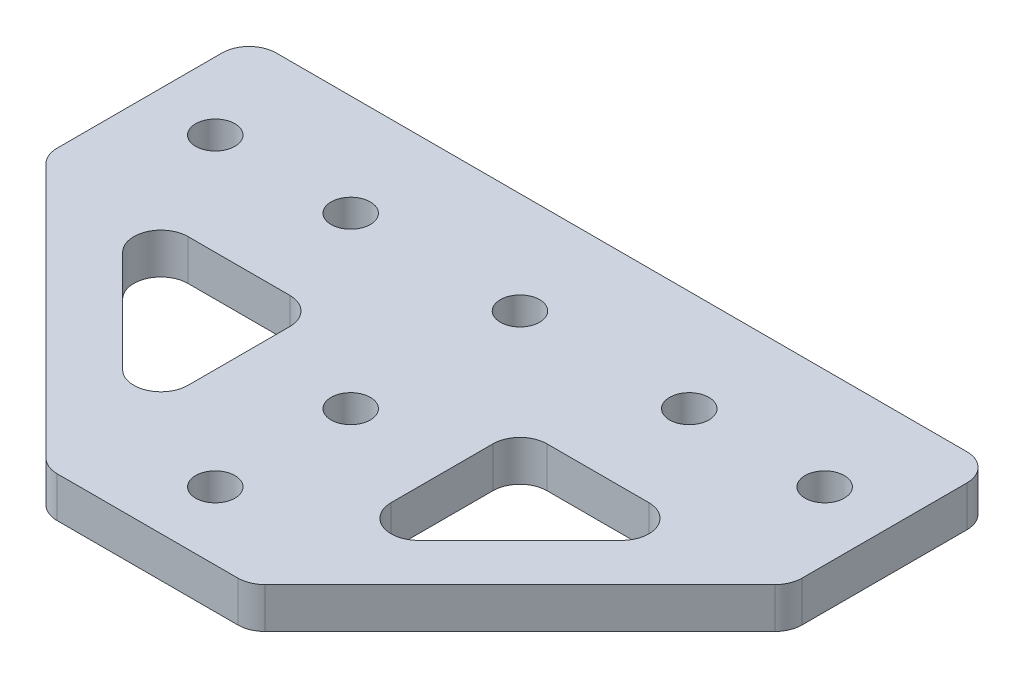
ISO-10303-21;
HEADER;
FILE_DESCRIPTION(('STEP AP214'),'2;1');
FILE_NAME('part.step','',(''),(''),'','','');
FILE_SCHEMA(('AUTOMOTIVE_DESIGN { 1 0 10303 214 1 1 1 1 }'));
ENDSEC;
DATA;
#1=APPLICATION_CONTEXT('core data for automotive mechanical design processes');
#2=APPLICATION_PROTOCOL_DEFINITION('international standard','automotive_design',2000,#1);
#3=PRODUCT_CONTEXT('',#1,'mechanical');
#4=PRODUCT('Part','Part','',(#3));
#5=PRODUCT_RELATED_PRODUCT_CATEGORY('part','',(#4));
#6=PRODUCT_DEFINITION_FORMATION('','',#4);
#7=PRODUCT_DEFINITION_CONTEXT('part definition',#1,'design');
#8=PRODUCT_DEFINITION('design','',#6,#7);
#9=PRODUCT_DEFINITION_SHAPE('','',#8);
#10=(LENGTH_UNIT() NAMED_UNIT(*) SI_UNIT(.MILLI.,.METRE.));
#11=(NAMED_UNIT(*) PLANE_ANGLE_UNIT() SI_UNIT($,.RADIAN.));
#12=(NAMED_UNIT(*) SI_UNIT($,.STERADIAN.) SOLID_ANGLE_UNIT());
#13=UNCERTAINTY_MEASURE_WITH_UNIT(LENGTH_MEASURE(1.E-05),#10,'distance_accuracy_value','');
#14=(GEOMETRIC_REPRESENTATION_CONTEXT(3) GLOBAL_UNCERTAINTY_ASSIGNED_CONTEXT((#13)) GLOBAL_UNIT_ASSIGNED_CONTEXT((#10,
#11,#12)) REPRESENTATION_CONTEXT('',''));
#15=CARTESIAN_POINT('',(0.,0.,0.));
#16=DIRECTION('',(0.,0.,1.));
#17=DIRECTION('',(1.,0.,0.));
#18=AXIS2_PLACEMENT_3D('',#15,#16,#17);
#19=CARTESIAN_POINT('',(0.,3.,0.));
#20=DIRECTION('',(1.,0.,0.));
#21=DIRECTION('',(0.,0.,-1.));
#22=AXIS2_PLACEMENT_3D('',#19,#20,#21);
#23=PLANE('',#22);
#24=DIRECTION('',(0.,0.,1.));
#25=VECTOR('',#24,1.);
#26=CARTESIAN_POINT('',(0.,0.,0.));
#27=LINE('',#26,#25);
#28=CARTESIAN_POINT('',(0.,0.,17.));
#29=VERTEX_POINT('',#28);
#30=CARTESIAN_POINT('',(0.,0.,24.5147186257614));
#31=VERTEX_POINT('',#30);
#32=EDGE_CURVE('E396',#29,#31,#27,.T.);
#33=ORIENTED_EDGE('',*,*,#32,.F.);
#34=DIRECTION('',(0.,-1.,0.));
#35=VECTOR('',#34,1.);
#36=CARTESIAN_POINT('',(0.,3.,17.));
#37=LINE('',#36,#35);
#38=CARTESIAN_POINT('',(0.,3.,17.));
#39=VERTEX_POINT('',#38);
#40=EDGE_CURVE('E233',#29,#39,#37,.F.);
#41=ORIENTED_EDGE('',*,*,#40,.T.);
#42=DIRECTION('',(0.,0.,1.));
#43=VECTOR('',#42,1.);
#44=CARTESIAN_POINT('',(0.,3.,0.));
#45=LINE('',#44,#43);
#46=CARTESIAN_POINT('',(0.,3.,24.5147186257614));
#47=VERTEX_POINT('',#46);
#48=EDGE_CURVE('E212',#39,#47,#45,.T.);
#49=ORIENTED_EDGE('',*,*,#48,.T.);
#50=DIRECTION('',(0.,1.,0.));
#51=VECTOR('',#50,1.);
#52=CARTESIAN_POINT('',(0.,3.,24.5147186257614));
#53=LINE('',#52,#51);
#54=EDGE_CURVE('E231',#47,#31,#53,.F.);
#55=ORIENTED_EDGE('',*,*,#54,.T.);
#56=EDGE_LOOP('',(#33,#41,#49,#55));
#57=FACE_BOUND('',#56,.T.);
#58=ADVANCED_FACE('F43',(#57),#23,.T.);
#59=CARTESIAN_POINT('',(0.,3.,15.));
#60=DIRECTION('',(0.,0.,-1.));
#61=DIRECTION('',(-1.,0.,0.));
#62=AXIS2_PLACEMENT_3D('',#59,#60,#61);
#63=PLANE('',#62);
#64=DIRECTION('',(1.,0.,0.));
#65=VECTOR('',#64,1.);
#66=CARTESIAN_POINT('',(0.,3.,15.));
#67=LINE('',#66,#65);
#68=CARTESIAN_POINT('',(2.,3.,15.));
#69=VERTEX_POINT('',#68);
#70=CARTESIAN_POINT('',(9.51471862576143,3.,15.));
#71=VERTEX_POINT('',#70);
#72=EDGE_CURVE('E210',#69,#71,#67,.T.);
#73=ORIENTED_EDGE('',*,*,#72,.F.);
#74=DIRECTION('',(0.,-1.,0.));
#75=VECTOR('',#74,1.);
#76=CARTESIAN_POINT('',(2.,3.,15.));
#77=LINE('',#76,#75);
#78=CARTESIAN_POINT('',(2.,0.,15.));
#79=VERTEX_POINT('',#78);
#80=EDGE_CURVE('E224',#69,#79,#77,.T.);
#81=ORIENTED_EDGE('',*,*,#80,.T.);
#82=DIRECTION('',(1.,0.,0.));
#83=VECTOR('',#82,1.);
#84=CARTESIAN_POINT('',(0.,0.,15.));
#85=LINE('',#84,#83);
#86=CARTESIAN_POINT('',(9.51471862576143,0.,15.));
#87=VERTEX_POINT('',#86);
#88=EDGE_CURVE('E399',#79,#87,#85,.T.);
#89=ORIENTED_EDGE('',*,*,#88,.T.);
#90=DIRECTION('',(0.,1.,0.));
#91=VECTOR('',#90,1.);
#92=CARTESIAN_POINT('',(9.51471862576143,3.,15.));
#93=LINE('',#92,#91);
#94=EDGE_CURVE('E227',#87,#71,#93,.T.);
#95=ORIENTED_EDGE('',*,*,#94,.T.);
#96=EDGE_LOOP('',(#73,#81,#89,#95));
#97=FACE_BOUND('',#96,.T.);
#98=ADVANCED_FACE('F222',(#97),#63,.F.);
#99=CARTESIAN_POINT('',(-15.,3.,0.));
#100=DIRECTION('',(-1.,0.,0.));
#101=DIRECTION('',(0.,0.,1.));
#102=AXIS2_PLACEMENT_3D('',#99,#100,#101);
#103=PLANE('',#102);
#104=DIRECTION('',(0.,0.,-1.));
#105=VECTOR('',#104,1.);
#106=CARTESIAN_POINT('',(-15.,0.,0.));
#107=LINE('',#106,#105);
#108=CARTESIAN_POINT('',(-15.,0.,24.5147186257614));
#109=VERTEX_POINT('',#108);
#110=CARTESIAN_POINT('',(-15.,0.,17.));
#111=VERTEX_POINT('',#110);
#112=EDGE_CURVE('E336',#109,#111,#107,.T.);
#113=ORIENTED_EDGE('',*,*,#112,.F.);
#114=DIRECTION('',(0.,1.,0.));
#115=VECTOR('',#114,1.);
#116=CARTESIAN_POINT('',(-15.,3.,24.5147186257614));
#117=LINE('',#116,#115);
#118=CARTESIAN_POINT('',(-15.,3.,24.5147186257614));
#119=VERTEX_POINT('',#118);
#120=EDGE_CURVE('E302',#109,#119,#117,.T.);
#121=ORIENTED_EDGE('',*,*,#120,.T.);
#122=DIRECTION('',(0.,0.,-1.));
#123=VECTOR('',#122,1.);
#124=CARTESIAN_POINT('',(-15.,3.,0.));
#125=LINE('',#124,#123);
#126=CARTESIAN_POINT('',(-15.,3.,17.));
#127=VERTEX_POINT('',#126);
#128=EDGE_CURVE('E349',#119,#127,#125,.T.);
#129=ORIENTED_EDGE('',*,*,#128,.T.);
#130=DIRECTION('',(0.,-1.,0.));
#131=VECTOR('',#130,1.);
#132=CARTESIAN_POINT('',(-15.,3.,17.));
#133=LINE('',#132,#131);
#134=EDGE_CURVE('E299',#127,#111,#133,.T.);
#135=ORIENTED_EDGE('',*,*,#134,.T.);
#136=EDGE_LOOP('',(#113,#121,#129,#135));
#137=FACE_BOUND('',#136,.T.);
#138=ADVANCED_FACE('F348',(#137),#103,.T.);
#139=CARTESIAN_POINT('',(0.,3.,35.));
#140=DIRECTION('',(0.,0.,1.));
#141=DIRECTION('',(1.,0.,0.));
#142=AXIS2_PLACEMENT_3D('',#139,#140,#141);
#143=PLANE('',#142);
#144=DIRECTION('',(-1.,0.,0.));
#145=VECTOR('',#144,1.);
#146=CARTESIAN_POINT('',(0.,0.,35.));
#147=LINE('',#146,#145);
#148=CARTESIAN_POINT('',(-0.828427124746186,0.,35.));
#149=VERTEX_POINT('',#148);
#150=CARTESIAN_POINT('',(-14.1715728752538,0.,35.));
#151=VERTEX_POINT('',#150);
#152=EDGE_CURVE('E393',#149,#151,#147,.T.);
#153=ORIENTED_EDGE('',*,*,#152,.F.);
#154=DIRECTION('',(0.,-1.,0.));
#155=VECTOR('',#154,1.);
#156=CARTESIAN_POINT('',(-0.828427124746186,3.,35.));
#157=LINE('',#156,#155);
#158=CARTESIAN_POINT('',(-0.828427124746186,3.,35.));
#159=VERTEX_POINT('',#158);
#160=EDGE_CURVE('E287',#149,#159,#157,.F.);
#161=ORIENTED_EDGE('',*,*,#160,.T.);
#162=DIRECTION('',(-1.,0.,0.));
#163=VECTOR('',#162,1.);
#164=CARTESIAN_POINT('',(0.,3.,35.));
#165=LINE('',#164,#163);
#166=CARTESIAN_POINT('',(-14.1715728752538,3.,35.));
#167=VERTEX_POINT('',#166);
#168=EDGE_CURVE('E350',#159,#167,#165,.T.);
#169=ORIENTED_EDGE('',*,*,#168,.T.);
#170=DIRECTION('',(0.,-1.,0.));
#171=VECTOR('',#170,1.);
#172=CARTESIAN_POINT('',(-14.1715728752538,3.,35.));
#173=LINE('',#172,#171);
#174=EDGE_CURVE('E284',#167,#151,#173,.T.);
#175=ORIENTED_EDGE('',*,*,#174,.T.);
#176=EDGE_LOOP('',(#153,#161,#169,#175));
#177=FACE_BOUND('',#176,.T.);
#178=ADVANCED_FACE('F483',(#177),#143,.T.);
#179=CARTESIAN_POINT('',(20.,3.,0.));
#180=DIRECTION('',(-1.,0.,0.));
#181=DIRECTION('',(0.,0.,1.));
#182=AXIS2_PLACEMENT_3D('',#179,#180,#181);
#183=PLANE('',#182);
#184=DIRECTION('',(0.,0.,-1.));
#185=VECTOR('',#184,1.);
#186=CARTESIAN_POINT('',(20.,0.,0.));
#187=LINE('',#186,#185);
#188=CARTESIAN_POINT('',(20.,0.,14.1715728752538));
#189=VERTEX_POINT('',#188);
#190=CARTESIAN_POINT('',(20.,0.,2.));
#191=VERTEX_POINT('',#190);
#192=EDGE_CURVE('E401',#189,#191,#187,.T.);
#193=ORIENTED_EDGE('',*,*,#192,.T.);
#194=DIRECTION('',(0.,-1.,0.));
#195=VECTOR('',#194,1.);
#196=CARTESIAN_POINT('',(20.,3.,2.));
#197=LINE('',#196,#195);
#198=CARTESIAN_POINT('',(20.,3.,2.));
#199=VERTEX_POINT('',#198);
#200=EDGE_CURVE('E265',#191,#199,#197,.F.);
#201=ORIENTED_EDGE('',*,*,#200,.T.);
#202=DIRECTION('',(0.,0.,-1.));
#203=VECTOR('',#202,1.);
#204=CARTESIAN_POINT('',(20.,3.,0.));
#205=LINE('',#204,#203);
#206=CARTESIAN_POINT('',(20.,3.,14.1715728752538));
#207=VERTEX_POINT('',#206);
#208=EDGE_CURVE('E228',#207,#199,#205,.T.);
#209=ORIENTED_EDGE('',*,*,#208,.F.);
#210=DIRECTION('',(0.,-1.,0.));
#211=VECTOR('',#210,1.);
#212=CARTESIAN_POINT('',(20.,3.,14.1715728752538));
#213=LINE('',#212,#211);
#214=EDGE_CURVE('E262',#207,#189,#213,.T.);
#215=ORIENTED_EDGE('',*,*,#214,.T.);
#216=EDGE_LOOP('',(#193,#201,#209,#215));
#217=FACE_BOUND('',#216,.T.);
#218=ADVANCED_FACE('F486',(#217),#183,.F.);
#219=CARTESIAN_POINT('',(0.,3.,0.));
#220=DIRECTION('',(0.,0.,1.));
#221=DIRECTION('',(1.,0.,0.));
#222=AXIS2_PLACEMENT_3D('',#219,#220,#221);
#223=PLANE('',#222);
#224=DIRECTION('',(-1.,0.,0.));
#225=VECTOR('',#224,1.);
#226=CARTESIAN_POINT('',(0.,3.,0.));
#227=LINE('',#226,#225);
#228=CARTESIAN_POINT('',(18.,3.,0.));
#229=VERTEX_POINT('',#228);
#230=CARTESIAN_POINT('',(-33.,3.,0.));
#231=VERTEX_POINT('',#230);
#232=EDGE_CURVE('E363',#229,#231,#227,.T.);
#233=ORIENTED_EDGE('',*,*,#232,.F.);
#234=DIRECTION('',(0.,-1.,0.));
#235=VECTOR('',#234,1.);
#236=CARTESIAN_POINT('',(18.,3.,0.));
#237=LINE('',#236,#235);
#238=CARTESIAN_POINT('',(18.,0.,0.));
#239=VERTEX_POINT('',#238);
#240=EDGE_CURVE('E247',#229,#239,#237,.T.);
#241=ORIENTED_EDGE('',*,*,#240,.T.);
#242=DIRECTION('',(-1.,0.,0.));
#243=VECTOR('',#242,1.);
#244=CARTESIAN_POINT('',(0.,0.,0.));
#245=LINE('',#244,#243);
#246=CARTESIAN_POINT('',(-33.,0.,0.));
#247=VERTEX_POINT('',#246);
#248=EDGE_CURVE('E404',#239,#247,#245,.T.);
#249=ORIENTED_EDGE('',*,*,#248,.T.);
#250=DIRECTION('',(0.,-1.,0.));
#251=VECTOR('',#250,1.);
#252=CARTESIAN_POINT('',(-33.,3.,0.));
#253=LINE('',#252,#251);
#254=EDGE_CURVE('E245',#247,#231,#253,.F.);
#255=ORIENTED_EDGE('',*,*,#254,.T.);
#256=EDGE_LOOP('',(#233,#241,#249,#255));
#257=FACE_BOUND('',#256,.T.);
#258=ADVANCED_FACE('F468',(#257),#223,.F.);
#259=CARTESIAN_POINT('',(-35.,3.,0.));
#260=DIRECTION('',(1.,0.,0.));
#261=DIRECTION('',(0.,0.,-1.));
#262=AXIS2_PLACEMENT_3D('',#259,#260,#261);
#263=PLANE('',#262);
#264=DIRECTION('',(0.,0.,1.));
#265=VECTOR('',#264,1.);
#266=CARTESIAN_POINT('',(-35.,0.,0.));
#267=LINE('',#266,#265);
#268=CARTESIAN_POINT('',(-35.,0.,2.));
#269=VERTEX_POINT('',#268);
#270=CARTESIAN_POINT('',(-35.,0.,14.1715728752538));
#271=VERTEX_POINT('',#270);
#272=EDGE_CURVE('E345',#269,#271,#267,.T.);
#273=ORIENTED_EDGE('',*,*,#272,.T.);
#274=DIRECTION('',(0.,-1.,0.));
#275=VECTOR('',#274,1.);
#276=CARTESIAN_POINT('',(-35.,3.,14.1715728752538));
#277=LINE('',#276,#275);
#278=CARTESIAN_POINT('',(-35.,3.,14.1715728752538));
#279=VERTEX_POINT('',#278);
#280=EDGE_CURVE('E297',#271,#279,#277,.F.);
#281=ORIENTED_EDGE('',*,*,#280,.T.);
#282=DIRECTION('',(0.,0.,1.));
#283=VECTOR('',#282,1.);
#284=CARTESIAN_POINT('',(-35.,3.,0.));
#285=LINE('',#284,#283);
#286=CARTESIAN_POINT('',(-35.,3.,2.));
#287=VERTEX_POINT('',#286);
#288=EDGE_CURVE('E366',#287,#279,#285,.T.);
#289=ORIENTED_EDGE('',*,*,#288,.F.);
#290=DIRECTION('',(0.,-1.,0.));
#291=VECTOR('',#290,1.);
#292=CARTESIAN_POINT('',(-35.,3.,2.));
#293=LINE('',#292,#291);
#294=EDGE_CURVE('E294',#287,#269,#293,.T.);
#295=ORIENTED_EDGE('',*,*,#294,.T.);
#296=EDGE_LOOP('',(#273,#281,#289,#295));
#297=FACE_BOUND('',#296,.T.);
#298=ADVANCED_FACE('F460',(#297),#263,.F.);
#299=CARTESIAN_POINT('',(15.,3.,7.50000000000001));
#300=DIRECTION('',(0.,-1.,0.));
#301=DIRECTION('',(0.,0.,-1.));
#302=AXIS2_PLACEMENT_3D('',#299,#300,#301);
#303=CYLINDRICAL_SURFACE('',#302,1.45);
#304=CARTESIAN_POINT('',(15.,3.,7.50000000000001));
#305=DIRECTION('',(0.,1.,0.));
#306=DIRECTION('',(0.,0.,1.));
#307=AXIS2_PLACEMENT_3D('',#304,#305,#306);
#308=CIRCLE('',#307,1.45);
#309=CARTESIAN_POINT('',(15.,3.,8.95000000000001));
#310=VERTEX_POINT('',#309);
#311=EDGE_CURVE('E371',#310,#310,#308,.F.);
#312=ORIENTED_EDGE('',*,*,#311,.F.);
#313=EDGE_LOOP('',(#312));
#314=FACE_BOUND('',#313,.T.);
#315=CARTESIAN_POINT('',(15.,0.,7.50000000000001));
#316=DIRECTION('',(0.,1.,0.));
#317=DIRECTION('',(0.,0.,1.));
#318=AXIS2_PLACEMENT_3D('',#315,#316,#317);
#319=CIRCLE('',#318,1.45);
#320=CARTESIAN_POINT('',(15.,0.,8.95000000000001));
#321=VERTEX_POINT('',#320);
#322=EDGE_CURVE('E344',#321,#321,#319,.F.);
#323=ORIENTED_EDGE('',*,*,#322,.T.);
#324=EDGE_LOOP('',(#323));
#325=FACE_BOUND('',#324,.T.);
#326=ADVANCED_FACE('F458',(#314,#325),#303,.F.);
#327=CARTESIAN_POINT('',(0.,3.,15.));
#328=DIRECTION('',(0.,0.,-1.));
#329=DIRECTION('',(-1.,0.,0.));
#330=AXIS2_PLACEMENT_3D('',#327,#328,#329);
#331=PLANE('',#330);
#332=DIRECTION('',(1.,0.,0.));
#333=VECTOR('',#332,1.);
#334=CARTESIAN_POINT('',(0.,3.,15.));
#335=LINE('',#334,#333);
#336=CARTESIAN_POINT('',(-24.5147186257614,3.,15.));
#337=VERTEX_POINT('',#336);
#338=CARTESIAN_POINT('',(-17.,3.,15.));
#339=VERTEX_POINT('',#338);
#340=EDGE_CURVE('E369',#337,#339,#335,.T.);
#341=ORIENTED_EDGE('',*,*,#340,.F.);
#342=DIRECTION('',(0.,1.,0.));
#343=VECTOR('',#342,1.);
#344=CARTESIAN_POINT('',(-24.5147186257614,3.,15.));
#345=LINE('',#344,#343);
#346=CARTESIAN_POINT('',(-24.5147186257614,0.,15.));
#347=VERTEX_POINT('',#346);
#348=EDGE_CURVE('E311',#337,#347,#345,.F.);
#349=ORIENTED_EDGE('',*,*,#348,.T.);
#350=DIRECTION('',(1.,0.,0.));
#351=VECTOR('',#350,1.);
#352=CARTESIAN_POINT('',(0.,0.,15.));
#353=LINE('',#352,#351);
#354=CARTESIAN_POINT('',(-17.,0.,15.));
#355=VERTEX_POINT('',#354);
#356=EDGE_CURVE('E333',#347,#355,#353,.T.);
#357=ORIENTED_EDGE('',*,*,#356,.T.);
#358=DIRECTION('',(0.,-1.,0.));
#359=VECTOR('',#358,1.);
#360=CARTESIAN_POINT('',(-17.,3.,15.));
#361=LINE('',#360,#359);
#362=EDGE_CURVE('E309',#355,#339,#361,.F.);
#363=ORIENTED_EDGE('',*,*,#362,.T.);
#364=EDGE_LOOP('',(#341,#349,#357,#363));
#365=FACE_BOUND('',#364,.T.);
#366=ADVANCED_FACE('F342',(#365),#331,.F.);
#367=CARTESIAN_POINT('',(-7.50000000000001,3.,7.5));
#368=DIRECTION('',(0.,-1.,0.));
#369=DIRECTION('',(0.,0.,-1.));
#370=AXIS2_PLACEMENT_3D('',#367,#368,#369);
#371=CYLINDRICAL_SURFACE('',#370,1.45);
#372=CARTESIAN_POINT('',(-7.50000000000001,3.,7.5));
#373=DIRECTION('',(0.,1.,0.));
#374=DIRECTION('',(0.,0.,1.));
#375=AXIS2_PLACEMENT_3D('',#372,#373,#374);
#376=CIRCLE('',#375,1.45);
#377=CARTESIAN_POINT('',(-7.50000000000001,3.,8.95));
#378=VERTEX_POINT('',#377);
#379=EDGE_CURVE('E351',#378,#378,#376,.T.);
#380=ORIENTED_EDGE('',*,*,#379,.T.);
#381=EDGE_LOOP('',(#380));
#382=FACE_BOUND('',#381,.T.);
#383=CARTESIAN_POINT('',(-7.50000000000001,0.,7.5));
#384=DIRECTION('',(0.,1.,0.));
#385=DIRECTION('',(0.,0.,1.));
#386=AXIS2_PLACEMENT_3D('',#383,#384,#385);
#387=CIRCLE('',#386,1.45);
#388=CARTESIAN_POINT('',(-7.50000000000001,0.,8.95));
#389=VERTEX_POINT('',#388);
#390=EDGE_CURVE('E389',#389,#389,#387,.T.);
#391=ORIENTED_EDGE('',*,*,#390,.F.);
#392=EDGE_LOOP('',(#391));
#393=FACE_BOUND('',#392,.T.);
#394=ADVANCED_FACE('F441',(#382,#393),#371,.F.);
#395=CARTESIAN_POINT('',(-20.,3.,7.50000000000001));
#396=DIRECTION('',(0.,-1.,0.));
#397=DIRECTION('',(0.,0.,-1.));
#398=AXIS2_PLACEMENT_3D('',#395,#396,#397);
#399=CYLINDRICAL_SURFACE('',#398,1.45);
#400=CARTESIAN_POINT('',(-20.,3.,7.50000000000001));
#401=DIRECTION('',(0.,1.,0.));
#402=DIRECTION('',(0.,0.,1.));
#403=AXIS2_PLACEMENT_3D('',#400,#401,#402);
#404=CIRCLE('',#403,1.45);
#405=CARTESIAN_POINT('',(-20.,3.,8.95000000000001));
#406=VERTEX_POINT('',#405);
#407=EDGE_CURVE('E356',#406,#406,#404,.T.);
#408=ORIENTED_EDGE('',*,*,#407,.T.);
#409=EDGE_LOOP('',(#408));
#410=FACE_BOUND('',#409,.T.);
#411=CARTESIAN_POINT('',(-20.,0.,7.50000000000001));
#412=DIRECTION('',(0.,1.,0.));
#413=DIRECTION('',(0.,0.,1.));
#414=AXIS2_PLACEMENT_3D('',#411,#412,#413);
#415=CIRCLE('',#414,1.45);
#416=CARTESIAN_POINT('',(-20.,0.,8.95000000000001));
#417=VERTEX_POINT('',#416);
#418=EDGE_CURVE('E386',#417,#417,#415,.T.);
#419=ORIENTED_EDGE('',*,*,#418,.F.);
#420=EDGE_LOOP('',(#419));
#421=FACE_BOUND('',#420,.T.);
#422=ADVANCED_FACE('F431',(#410,#421),#399,.F.);
#423=CARTESIAN_POINT('',(-30.,3.,7.50000000000001));
#424=DIRECTION('',(0.,-1.,0.));
#425=DIRECTION('',(0.,0.,-1.));
#426=AXIS2_PLACEMENT_3D('',#423,#424,#425);
#427=CYLINDRICAL_SURFACE('',#426,1.45);
#428=CARTESIAN_POINT('',(-30.,3.,7.50000000000001));
#429=DIRECTION('',(0.,1.,0.));
#430=DIRECTION('',(0.,0.,1.));
#431=AXIS2_PLACEMENT_3D('',#428,#429,#430);
#432=CIRCLE('',#431,1.45);
#433=CARTESIAN_POINT('',(-30.,3.,8.95000000000001));
#434=VERTEX_POINT('',#433);
#435=EDGE_CURVE('E421',#434,#434,#432,.T.);
#436=ORIENTED_EDGE('',*,*,#435,.T.);
#437=EDGE_LOOP('',(#436));
#438=FACE_BOUND('',#437,.T.);
#439=CARTESIAN_POINT('',(-30.,0.,7.50000000000001));
#440=DIRECTION('',(0.,1.,0.));
#441=DIRECTION('',(0.,0.,1.));
#442=AXIS2_PLACEMENT_3D('',#439,#440,#441);
#443=CIRCLE('',#442,1.45);
#444=CARTESIAN_POINT('',(-30.,0.,8.95000000000001));
#445=VERTEX_POINT('',#444);
#446=EDGE_CURVE('E383',#445,#445,#443,.T.);
#447=ORIENTED_EDGE('',*,*,#446,.F.);
#448=EDGE_LOOP('',(#447));
#449=FACE_BOUND('',#448,.T.);
#450=ADVANCED_FACE('F492',(#438,#449),#427,.F.);
#451=CARTESIAN_POINT('',(-7.5,3.,20.));
#452=DIRECTION('',(0.,-1.,0.));
#453=DIRECTION('',(0.,0.,-1.));
#454=AXIS2_PLACEMENT_3D('',#451,#452,#453);
#455=CYLINDRICAL_SURFACE('',#454,1.45);
#456=CARTESIAN_POINT('',(-7.5,3.,20.));
#457=DIRECTION('',(0.,1.,0.));
#458=DIRECTION('',(0.,0.,1.));
#459=AXIS2_PLACEMENT_3D('',#456,#457,#458);
#460=CIRCLE('',#459,1.45);
#461=CARTESIAN_POINT('',(-7.5,3.,21.45));
#462=VERTEX_POINT('',#461);
#463=EDGE_CURVE('E416',#462,#462,#460,.T.);
#464=ORIENTED_EDGE('',*,*,#463,.T.);
#465=EDGE_LOOP('',(#464));
#466=FACE_BOUND('',#465,.T.);
#467=CARTESIAN_POINT('',(-7.5,0.,20.));
#468=DIRECTION('',(0.,1.,0.));
#469=DIRECTION('',(0.,0.,1.));
#470=AXIS2_PLACEMENT_3D('',#467,#468,#469);
#471=CIRCLE('',#470,1.45);
#472=CARTESIAN_POINT('',(-7.5,0.,21.45));
#473=VERTEX_POINT('',#472);
#474=EDGE_CURVE('E379',#473,#473,#471,.T.);
#475=ORIENTED_EDGE('',*,*,#474,.F.);
#476=EDGE_LOOP('',(#475));
#477=FACE_BOUND('',#476,.T.);
#478=ADVANCED_FACE('F495',(#466,#477),#455,.F.);
#479=CARTESIAN_POINT('',(-7.5,3.,30.));
#480=DIRECTION('',(0.,-1.,0.));
#481=DIRECTION('',(0.,0.,-1.));
#482=AXIS2_PLACEMENT_3D('',#479,#480,#481);
#483=CYLINDRICAL_SURFACE('',#482,1.45);
#484=CARTESIAN_POINT('',(-7.5,3.,30.));
#485=DIRECTION('',(0.,1.,0.));
#486=DIRECTION('',(0.,0.,1.));
#487=AXIS2_PLACEMENT_3D('',#484,#485,#486);
#488=CIRCLE('',#487,1.45);
#489=CARTESIAN_POINT('',(-7.5,3.,31.45));
#490=VERTEX_POINT('',#489);
#491=EDGE_CURVE('E412',#490,#490,#488,.T.);
#492=ORIENTED_EDGE('',*,*,#491,.T.);
#493=EDGE_LOOP('',(#492));
#494=FACE_BOUND('',#493,.T.);
#495=CARTESIAN_POINT('',(-7.5,0.,30.));
#496=DIRECTION('',(0.,1.,0.));
#497=DIRECTION('',(0.,0.,1.));
#498=AXIS2_PLACEMENT_3D('',#495,#496,#497);
#499=CIRCLE('',#498,1.45);
#500=CARTESIAN_POINT('',(-7.5,0.,31.45));
#501=VERTEX_POINT('',#500);
#502=EDGE_CURVE('E376',#501,#501,#499,.T.);
#503=ORIENTED_EDGE('',*,*,#502,.F.);
#504=EDGE_LOOP('',(#503));
#505=FACE_BOUND('',#504,.T.);
#506=ADVANCED_FACE('F499',(#494,#505),#483,.F.);
#507=CARTESIAN_POINT('',(5.,3.,7.50000000000001));
#508=DIRECTION('',(0.,-1.,0.));
#509=DIRECTION('',(0.,0.,-1.));
#510=AXIS2_PLACEMENT_3D('',#507,#508,#509);
#511=CYLINDRICAL_SURFACE('',#510,1.45);
#512=CARTESIAN_POINT('',(5.,3.,7.50000000000001));
#513=DIRECTION('',(0.,1.,0.));
#514=DIRECTION('',(0.,0.,1.));
#515=AXIS2_PLACEMENT_3D('',#512,#513,#514);
#516=CIRCLE('',#515,1.45);
#517=CARTESIAN_POINT('',(5.,3.,8.95000000000001));
#518=VERTEX_POINT('',#517);
#519=EDGE_CURVE('E235',#518,#518,#516,.F.);
#520=ORIENTED_EDGE('',*,*,#519,.F.);
#521=EDGE_LOOP('',(#520));
#522=FACE_BOUND('',#521,.T.);
#523=CARTESIAN_POINT('',(5.,0.,7.50000000000001));
#524=DIRECTION('',(0.,1.,0.));
#525=DIRECTION('',(0.,0.,1.));
#526=AXIS2_PLACEMENT_3D('',#523,#524,#525);
#527=CIRCLE('',#526,1.45);
#528=CARTESIAN_POINT('',(5.,0.,8.95000000000001));
#529=VERTEX_POINT('',#528);
#530=EDGE_CURVE('E410',#529,#529,#527,.F.);
#531=ORIENTED_EDGE('',*,*,#530,.T.);
#532=EDGE_LOOP('',(#531));
#533=FACE_BOUND('',#532,.T.);
#534=ADVANCED_FACE('F436',(#522,#533),#511,.F.);
#535=CARTESIAN_POINT('',(0.,3.,0.));
#536=DIRECTION('',(0.,1.,0.));
#537=DIRECTION('',(0.,0.,1.));
#538=AXIS2_PLACEMENT_3D('',#535,#536,#537);
#539=PLANE('',#538);
#540=ORIENTED_EDGE('',*,*,#208,.T.);
#541=CARTESIAN_POINT('',(18.,3.,2.));
#542=DIRECTION('',(0.,1.,0.));
#543=DIRECTION('',(0.,0.,1.));
#544=AXIS2_PLACEMENT_3D('',#541,#542,#543);
#545=CIRCLE('',#544,2.);
#546=EDGE_CURVE('E277',#199,#229,#545,.T.);
#547=ORIENTED_EDGE('',*,*,#546,.T.);
#548=ORIENTED_EDGE('',*,*,#232,.T.);
#549=CARTESIAN_POINT('',(-33.,3.,2.));
#550=DIRECTION('',(0.,1.,0.));
#551=DIRECTION('',(0.,0.,1.));
#552=AXIS2_PLACEMENT_3D('',#549,#550,#551);
#553=CIRCLE('',#552,2.);
#554=EDGE_CURVE('E267',#231,#287,#553,.T.);
#555=ORIENTED_EDGE('',*,*,#554,.T.);
#556=ORIENTED_EDGE('',*,*,#288,.T.);
#557=CARTESIAN_POINT('',(-33.,3.,14.1715728752538));
#558=DIRECTION('',(0.,1.,0.));
#559=DIRECTION('',(0.,0.,1.));
#560=AXIS2_PLACEMENT_3D('',#557,#558,#559);
#561=CIRCLE('',#560,2.);
#562=CARTESIAN_POINT('',(-34.4142135623731,3.,15.5857864376269));
#563=VERTEX_POINT('',#562);
#564=EDGE_CURVE('E269',#279,#563,#561,.T.);
#565=ORIENTED_EDGE('',*,*,#564,.T.);
#566=DIRECTION('',(0.707106781186548,0.,0.707106781186547));
#567=VECTOR('',#566,1.);
#568=CARTESIAN_POINT('',(-35.,3.,15.));
#569=LINE('',#568,#567);
#570=CARTESIAN_POINT('',(-15.5857864376269,3.,34.4142135623731));
#571=VERTEX_POINT('',#570);
#572=EDGE_CURVE('E557',#563,#571,#569,.T.);
#573=ORIENTED_EDGE('',*,*,#572,.T.);
#574=CARTESIAN_POINT('',(-14.1715728752538,3.,33.));
#575=DIRECTION('',(0.,1.,0.));
#576=DIRECTION('',(0.,0.,1.));
#577=AXIS2_PLACEMENT_3D('',#574,#575,#576);
#578=CIRCLE('',#577,2.);
#579=EDGE_CURVE('E271',#571,#167,#578,.T.);
#580=ORIENTED_EDGE('',*,*,#579,.T.);
#581=ORIENTED_EDGE('',*,*,#168,.F.);
#582=CARTESIAN_POINT('',(-0.828427124746185,3.,33.));
#583=DIRECTION('',(0.,1.,0.));
#584=DIRECTION('',(0.,0.,1.));
#585=AXIS2_PLACEMENT_3D('',#582,#583,#584);
#586=CIRCLE('',#585,2.);
#587=CARTESIAN_POINT('',(0.585786437626901,3.,34.4142135623731));
#588=VERTEX_POINT('',#587);
#589=EDGE_CURVE('E273',#159,#588,#586,.T.);
#590=ORIENTED_EDGE('',*,*,#589,.T.);
#591=DIRECTION('',(-0.707106781186548,0.,0.707106781186547));
#592=VECTOR('',#591,1.);
#593=CARTESIAN_POINT('',(20.,3.,15.));
#594=LINE('',#593,#592);
#595=CARTESIAN_POINT('',(19.4142135623731,3.,15.5857864376269));
#596=VERTEX_POINT('',#595);
#597=EDGE_CURVE('E562',#596,#588,#594,.T.);
#598=ORIENTED_EDGE('',*,*,#597,.F.);
#599=CARTESIAN_POINT('',(18.,3.,14.1715728752538));
#600=DIRECTION('',(0.,1.,0.));
#601=DIRECTION('',(0.,0.,1.));
#602=AXIS2_PLACEMENT_3D('',#599,#600,#601);
#603=CIRCLE('',#602,2.);
#604=EDGE_CURVE('E275',#596,#207,#603,.T.);
#605=ORIENTED_EDGE('',*,*,#604,.T.);
#606=EDGE_LOOP('',(#540,#547,#548,#555,#556,#565,#573,#580,#581,#590,#598,#605));
#607=FACE_BOUND('',#606,.T.);
#608=ORIENTED_EDGE('',*,*,#128,.F.);
#609=CARTESIAN_POINT('',(-17.,3.,24.5147186257614));
#610=DIRECTION('',(0.,1.,0.));
#611=DIRECTION('',(0.,0.,1.));
#612=AXIS2_PLACEMENT_3D('',#609,#610,#611);
#613=CIRCLE('',#612,2.);
#614=CARTESIAN_POINT('',(-18.4142135623731,3.,25.9289321881345));
#615=VERTEX_POINT('',#614);
#616=EDGE_CURVE('E64',#119,#615,#613,.F.);
#617=ORIENTED_EDGE('',*,*,#616,.T.);
#618=DIRECTION('',(-0.707106781186547,0.,-0.707106781186548));
#619=VECTOR('',#618,1.);
#620=CARTESIAN_POINT('',(-15.,3.,29.3431457505076));
#621=LINE('',#620,#619);
#622=CARTESIAN_POINT('',(-25.9289321881345,3.,18.4142135623731));
#623=VERTEX_POINT('',#622);
#624=EDGE_CURVE('E555',#615,#623,#621,.T.);
#625=ORIENTED_EDGE('',*,*,#624,.T.);
#626=CARTESIAN_POINT('',(-24.5147186257614,3.,17.));
#627=DIRECTION('',(0.,1.,0.));
#628=DIRECTION('',(0.,0.,1.));
#629=AXIS2_PLACEMENT_3D('',#626,#627,#628);
#630=CIRCLE('',#629,2.);
#631=EDGE_CURVE('E324',#623,#337,#630,.F.);
#632=ORIENTED_EDGE('',*,*,#631,.T.);
#633=ORIENTED_EDGE('',*,*,#340,.T.);
#634=CARTESIAN_POINT('',(-17.,3.,17.));
#635=DIRECTION('',(0.,1.,0.));
#636=DIRECTION('',(0.,0.,1.));
#637=AXIS2_PLACEMENT_3D('',#634,#635,#636);
#638=CIRCLE('',#637,2.);
#639=EDGE_CURVE('E11',#339,#127,#638,.F.);
#640=ORIENTED_EDGE('',*,*,#639,.T.);
#641=EDGE_LOOP('',(#608,#617,#625,#632,#633,#640));
#642=FACE_BOUND('',#641,.T.);
#643=ORIENTED_EDGE('',*,*,#491,.F.);
#644=EDGE_LOOP('',(#643));
#645=FACE_BOUND('',#644,.T.);
#646=ORIENTED_EDGE('',*,*,#463,.F.);
#647=EDGE_LOOP('',(#646));
#648=FACE_BOUND('',#647,.T.);
#649=ORIENTED_EDGE('',*,*,#435,.F.);
#650=EDGE_LOOP('',(#649));
#651=FACE_BOUND('',#650,.T.);
#652=ORIENTED_EDGE('',*,*,#407,.F.);
#653=EDGE_LOOP('',(#652));
#654=FACE_BOUND('',#653,.T.);
#655=ORIENTED_EDGE('',*,*,#379,.F.);
#656=EDGE_LOOP('',(#655));
#657=FACE_BOUND('',#656,.T.);
#658=ORIENTED_EDGE('',*,*,#48,.F.);
#659=CARTESIAN_POINT('',(2.,3.,17.));
#660=DIRECTION('',(0.,1.,0.));
#661=DIRECTION('',(0.,0.,1.));
#662=AXIS2_PLACEMENT_3D('',#659,#660,#661);
#663=CIRCLE('',#662,2.);
#664=EDGE_CURVE('E206',#39,#69,#663,.F.);
#665=ORIENTED_EDGE('',*,*,#664,.T.);
#666=ORIENTED_EDGE('',*,*,#72,.T.);
#667=CARTESIAN_POINT('',(9.51471862576143,3.,17.));
#668=DIRECTION('',(0.,1.,0.));
#669=DIRECTION('',(0.,0.,1.));
#670=AXIS2_PLACEMENT_3D('',#667,#668,#669);
#671=CIRCLE('',#670,2.);
#672=CARTESIAN_POINT('',(10.9289321881345,3.,18.4142135623731));
#673=VERTEX_POINT('',#672);
#674=EDGE_CURVE('E216',#71,#673,#671,.F.);
#675=ORIENTED_EDGE('',*,*,#674,.T.);
#676=DIRECTION('',(0.707106781186547,0.,-0.707106781186548));
#677=VECTOR('',#676,1.);
#678=CARTESIAN_POINT('',(0.,3.,29.3431457505076));
#679=LINE('',#678,#677);
#680=CARTESIAN_POINT('',(3.4142135623731,3.,25.9289321881345));
#681=VERTEX_POINT('',#680);
#682=EDGE_CURVE('E560',#681,#673,#679,.T.);
#683=ORIENTED_EDGE('',*,*,#682,.F.);
#684=CARTESIAN_POINT('',(2.,3.,24.5147186257614));
#685=DIRECTION('',(0.,1.,0.));
#686=DIRECTION('',(0.,0.,1.));
#687=AXIS2_PLACEMENT_3D('',#684,#685,#686);
#688=CIRCLE('',#687,2.);
#689=EDGE_CURVE('E317',#681,#47,#688,.F.);
#690=ORIENTED_EDGE('',*,*,#689,.T.);
#691=EDGE_LOOP('',(#658,#665,#666,#675,#683,#690));
#692=FACE_BOUND('',#691,.T.);
#693=ORIENTED_EDGE('',*,*,#311,.T.);
#694=EDGE_LOOP('',(#693));
#695=FACE_BOUND('',#694,.T.);
#696=ORIENTED_EDGE('',*,*,#519,.T.);
#697=EDGE_LOOP('',(#696));
#698=FACE_BOUND('',#697,.T.);
#699=ADVANCED_FACE('F208',(#607,#642,#645,#648,#651,#654,#657,#692,#695,#698),#539,.T.);
#700=CARTESIAN_POINT('',(0.,0.,0.));
#701=DIRECTION('',(0.,1.,0.));
#702=DIRECTION('',(0.,0.,1.));
#703=AXIS2_PLACEMENT_3D('',#700,#701,#702);
#704=PLANE('',#703);
#705=ORIENTED_EDGE('',*,*,#248,.F.);
#706=CARTESIAN_POINT('',(18.,0.,2.));
#707=DIRECTION('',(0.,1.,0.));
#708=DIRECTION('',(0.,0.,1.));
#709=AXIS2_PLACEMENT_3D('',#706,#707,#708);
#710=CIRCLE('',#709,2.);
#711=EDGE_CURVE('E260',#239,#191,#710,.F.);
#712=ORIENTED_EDGE('',*,*,#711,.T.);
#713=ORIENTED_EDGE('',*,*,#192,.F.);
#714=CARTESIAN_POINT('',(18.,0.,14.1715728752538));
#715=DIRECTION('',(0.,1.,0.));
#716=DIRECTION('',(0.,0.,1.));
#717=AXIS2_PLACEMENT_3D('',#714,#715,#716);
#718=CIRCLE('',#717,2.);
#719=CARTESIAN_POINT('',(19.4142135623731,0.,15.5857864376269));
#720=VERTEX_POINT('',#719);
#721=EDGE_CURVE('E258',#189,#720,#718,.F.);
#722=ORIENTED_EDGE('',*,*,#721,.T.);
#723=DIRECTION('',(-0.707106781186548,0.,0.707106781186547));
#724=VECTOR('',#723,1.);
#725=CARTESIAN_POINT('',(20.,0.,15.));
#726=LINE('',#725,#724);
#727=CARTESIAN_POINT('',(0.585786437626901,0.,34.4142135623731));
#728=VERTEX_POINT('',#727);
#729=EDGE_CURVE('E380',#720,#728,#726,.T.);
#730=ORIENTED_EDGE('',*,*,#729,.T.);
#731=CARTESIAN_POINT('',(-0.828427124746185,0.,33.));
#732=DIRECTION('',(0.,1.,0.));
#733=DIRECTION('',(0.,0.,1.));
#734=AXIS2_PLACEMENT_3D('',#731,#732,#733);
#735=CIRCLE('',#734,2.);
#736=EDGE_CURVE('E256',#728,#149,#735,.F.);
#737=ORIENTED_EDGE('',*,*,#736,.T.);
#738=ORIENTED_EDGE('',*,*,#152,.T.);
#739=CARTESIAN_POINT('',(-14.1715728752538,0.,33.));
#740=DIRECTION('',(0.,1.,0.));
#741=DIRECTION('',(0.,0.,1.));
#742=AXIS2_PLACEMENT_3D('',#739,#740,#741);
#743=CIRCLE('',#742,2.);
#744=CARTESIAN_POINT('',(-15.5857864376269,0.,34.4142135623731));
#745=VERTEX_POINT('',#744);
#746=EDGE_CURVE('E254',#151,#745,#743,.F.);
#747=ORIENTED_EDGE('',*,*,#746,.T.);
#748=DIRECTION('',(0.707106781186548,0.,0.707106781186547));
#749=VECTOR('',#748,1.);
#750=CARTESIAN_POINT('',(-35.,0.,15.));
#751=LINE('',#750,#749);
#752=CARTESIAN_POINT('',(-34.4142135623731,0.,15.5857864376269));
#753=VERTEX_POINT('',#752);
#754=EDGE_CURVE('E424',#753,#745,#751,.T.);
#755=ORIENTED_EDGE('',*,*,#754,.F.);
#756=CARTESIAN_POINT('',(-33.,0.,14.1715728752538));
#757=DIRECTION('',(0.,1.,0.));
#758=DIRECTION('',(0.,0.,1.));
#759=AXIS2_PLACEMENT_3D('',#756,#757,#758);
#760=CIRCLE('',#759,2.);
#761=EDGE_CURVE('E252',#753,#271,#760,.F.);
#762=ORIENTED_EDGE('',*,*,#761,.T.);
#763=ORIENTED_EDGE('',*,*,#272,.F.);
#764=CARTESIAN_POINT('',(-33.,0.,2.));
#765=DIRECTION('',(0.,1.,0.));
#766=DIRECTION('',(0.,0.,1.));
#767=AXIS2_PLACEMENT_3D('',#764,#765,#766);
#768=CIRCLE('',#767,2.);
#769=EDGE_CURVE('E250',#269,#247,#768,.F.);
#770=ORIENTED_EDGE('',*,*,#769,.T.);
#771=EDGE_LOOP('',(#705,#712,#713,#722,#730,#737,#738,#747,#755,#762,#763,#770));
#772=FACE_BOUND('',#771,.T.);
#773=ORIENTED_EDGE('',*,*,#356,.F.);
#774=CARTESIAN_POINT('',(-24.5147186257614,0.,17.));
#775=DIRECTION('',(0.,1.,0.));
#776=DIRECTION('',(0.,0.,1.));
#777=AXIS2_PLACEMENT_3D('',#774,#775,#776);
#778=CIRCLE('',#777,2.);
#779=CARTESIAN_POINT('',(-25.9289321881345,0.,18.4142135623731));
#780=VERTEX_POINT('',#779);
#781=EDGE_CURVE('E326',#347,#780,#778,.T.);
#782=ORIENTED_EDGE('',*,*,#781,.T.);
#783=DIRECTION('',(-0.707106781186547,0.,-0.707106781186548));
#784=VECTOR('',#783,1.);
#785=CARTESIAN_POINT('',(-15.,0.,29.3431457505076));
#786=LINE('',#785,#784);
#787=CARTESIAN_POINT('',(-18.4142135623731,0.,25.9289321881345));
#788=VERTEX_POINT('',#787);
#789=EDGE_CURVE('E549',#788,#780,#786,.T.);
#790=ORIENTED_EDGE('',*,*,#789,.F.);
#791=CARTESIAN_POINT('',(-17.,0.,24.5147186257614));
#792=DIRECTION('',(0.,1.,0.));
#793=DIRECTION('',(0.,0.,1.));
#794=AXIS2_PLACEMENT_3D('',#791,#792,#793);
#795=CIRCLE('',#794,2.);
#796=EDGE_CURVE('E322',#788,#109,#795,.T.);
#797=ORIENTED_EDGE('',*,*,#796,.T.);
#798=ORIENTED_EDGE('',*,*,#112,.T.);
#799=CARTESIAN_POINT('',(-17.,0.,17.));
#800=DIRECTION('',(0.,1.,0.));
#801=DIRECTION('',(0.,0.,1.));
#802=AXIS2_PLACEMENT_3D('',#799,#800,#801);
#803=CIRCLE('',#802,2.);
#804=EDGE_CURVE('E51',#111,#355,#803,.T.);
#805=ORIENTED_EDGE('',*,*,#804,.T.);
#806=EDGE_LOOP('',(#773,#782,#790,#797,#798,#805));
#807=FACE_BOUND('',#806,.T.);
#808=ORIENTED_EDGE('',*,*,#502,.T.);
#809=EDGE_LOOP('',(#808));
#810=FACE_BOUND('',#809,.T.);
#811=ORIENTED_EDGE('',*,*,#474,.T.);
#812=EDGE_LOOP('',(#811));
#813=FACE_BOUND('',#812,.T.);
#814=ORIENTED_EDGE('',*,*,#446,.T.);
#815=EDGE_LOOP('',(#814));
#816=FACE_BOUND('',#815,.T.);
#817=ORIENTED_EDGE('',*,*,#418,.T.);
#818=EDGE_LOOP('',(#817));
#819=FACE_BOUND('',#818,.T.);
#820=ORIENTED_EDGE('',*,*,#390,.T.);
#821=EDGE_LOOP('',(#820));
#822=FACE_BOUND('',#821,.T.);
#823=ORIENTED_EDGE('',*,*,#32,.T.);
#824=CARTESIAN_POINT('',(2.,0.,24.5147186257614));
#825=DIRECTION('',(0.,1.,0.));
#826=DIRECTION('',(0.,0.,1.));
#827=AXIS2_PLACEMENT_3D('',#824,#825,#826);
#828=CIRCLE('',#827,2.);
#829=CARTESIAN_POINT('',(3.4142135623731,0.,25.9289321881345));
#830=VERTEX_POINT('',#829);
#831=EDGE_CURVE('E319',#31,#830,#828,.T.);
#832=ORIENTED_EDGE('',*,*,#831,.T.);
#833=DIRECTION('',(0.707106781186547,0.,-0.707106781186548));
#834=VECTOR('',#833,1.);
#835=CARTESIAN_POINT('',(0.,0.,29.3431457505076));
#836=LINE('',#835,#834);
#837=CARTESIAN_POINT('',(10.9289321881345,0.,18.4142135623731));
#838=VERTEX_POINT('',#837);
#839=EDGE_CURVE('E565',#830,#838,#836,.T.);
#840=ORIENTED_EDGE('',*,*,#839,.T.);
#841=CARTESIAN_POINT('',(9.51471862576143,0.,17.));
#842=DIRECTION('',(0.,1.,0.));
#843=DIRECTION('',(0.,0.,1.));
#844=AXIS2_PLACEMENT_3D('',#841,#842,#843);
#845=CIRCLE('',#844,2.);
#846=EDGE_CURVE('E315',#838,#87,#845,.T.);
#847=ORIENTED_EDGE('',*,*,#846,.T.);
#848=ORIENTED_EDGE('',*,*,#88,.F.);
#849=CARTESIAN_POINT('',(2.,0.,17.));
#850=DIRECTION('',(0.,1.,0.));
#851=DIRECTION('',(0.,0.,1.));
#852=AXIS2_PLACEMENT_3D('',#849,#850,#851);
#853=CIRCLE('',#852,2.);
#854=EDGE_CURVE('E217',#79,#29,#853,.T.);
#855=ORIENTED_EDGE('',*,*,#854,.T.);
#856=EDGE_LOOP('',(#823,#832,#840,#847,#848,#855));
#857=FACE_BOUND('',#856,.T.);
#858=ORIENTED_EDGE('',*,*,#322,.F.);
#859=EDGE_LOOP('',(#858));
#860=FACE_BOUND('',#859,.T.);
#861=ORIENTED_EDGE('',*,*,#530,.F.);
#862=EDGE_LOOP('',(#861));
#863=FACE_BOUND('',#862,.T.);
#864=ADVANCED_FACE('F331',(#772,#807,#810,#813,#816,#819,#822,#857,#860,#863),#704,.F.);
#865=CARTESIAN_POINT('',(-15.,0.,29.3431457505076));
#866=DIRECTION('',(0.707106781186548,0.,-0.707106781186547));
#867=DIRECTION('',(-0.707106781186547,0.,-0.707106781186548));
#868=AXIS2_PLACEMENT_3D('',#865,#866,#867);
#869=PLANE('',#868);
#870=ORIENTED_EDGE('',*,*,#624,.F.);
#871=DIRECTION('',(0.,1.,0.));
#872=VECTOR('',#871,1.);
#873=CARTESIAN_POINT('',(-18.4142135623731,0.,25.9289321881345));
#874=LINE('',#873,#872);
#875=EDGE_CURVE('E307',#615,#788,#874,.F.);
#876=ORIENTED_EDGE('',*,*,#875,.T.);
#877=ORIENTED_EDGE('',*,*,#789,.T.);
#878=DIRECTION('',(0.,1.,0.));
#879=VECTOR('',#878,1.);
#880=CARTESIAN_POINT('',(-25.9289321881345,0.,18.4142135623731));
#881=LINE('',#880,#879);
#882=EDGE_CURVE('E304',#780,#623,#881,.T.);
#883=ORIENTED_EDGE('',*,*,#882,.T.);
#884=EDGE_LOOP('',(#870,#876,#877,#883));
#885=FACE_BOUND('',#884,.T.);
#886=ADVANCED_FACE('F449',(#885),#869,.T.);
#887=CARTESIAN_POINT('',(-35.,0.,15.));
#888=DIRECTION('',(-0.707106781186547,0.,0.707106781186548));
#889=DIRECTION('',(0.707106781186548,0.,0.707106781186547));
#890=AXIS2_PLACEMENT_3D('',#887,#888,#889);
#891=PLANE('',#890);
#892=ORIENTED_EDGE('',*,*,#754,.T.);
#893=DIRECTION('',(0.,-1.,0.));
#894=VECTOR('',#893,1.);
#895=CARTESIAN_POINT('',(-15.5857864376269,0.,34.4142135623731));
#896=LINE('',#895,#894);
#897=EDGE_CURVE('E292',#745,#571,#896,.F.);
#898=ORIENTED_EDGE('',*,*,#897,.T.);
#899=ORIENTED_EDGE('',*,*,#572,.F.);
#900=DIRECTION('',(0.,-1.,0.));
#901=VECTOR('',#900,1.);
#902=CARTESIAN_POINT('',(-34.4142135623731,0.,15.5857864376269));
#903=LINE('',#902,#901);
#904=EDGE_CURVE('E289',#563,#753,#903,.T.);
#905=ORIENTED_EDGE('',*,*,#904,.T.);
#906=EDGE_LOOP('',(#892,#898,#899,#905));
#907=FACE_BOUND('',#906,.T.);
#908=ADVANCED_FACE('F580',(#907),#891,.T.);
#909=CARTESIAN_POINT('',(0.,0.,29.3431457505076));
#910=DIRECTION('',(0.707106781186548,0.,0.707106781186547));
#911=DIRECTION('',(0.707106781186547,0.,-0.707106781186548));
#912=AXIS2_PLACEMENT_3D('',#909,#910,#911);
#913=PLANE('',#912);
#914=ORIENTED_EDGE('',*,*,#682,.T.);
#915=DIRECTION('',(0.,1.,0.));
#916=VECTOR('',#915,1.);
#917=CARTESIAN_POINT('',(10.9289321881345,0.,18.4142135623731));
#918=LINE('',#917,#916);
#919=EDGE_CURVE('E243',#673,#838,#918,.F.);
#920=ORIENTED_EDGE('',*,*,#919,.T.);
#921=ORIENTED_EDGE('',*,*,#839,.F.);
#922=DIRECTION('',(0.,1.,0.));
#923=VECTOR('',#922,1.);
#924=CARTESIAN_POINT('',(3.4142135623731,0.,25.9289321881345));
#925=LINE('',#924,#923);
#926=EDGE_CURVE('E240',#830,#681,#925,.T.);
#927=ORIENTED_EDGE('',*,*,#926,.T.);
#928=EDGE_LOOP('',(#914,#920,#921,#927));
#929=FACE_BOUND('',#928,.T.);
#930=ADVANCED_FACE('F577',(#929),#913,.F.);
#931=CARTESIAN_POINT('',(20.,0.,15.));
#932=DIRECTION('',(-0.707106781186547,0.,-0.707106781186548));
#933=DIRECTION('',(-0.707106781186548,0.,0.707106781186547));
#934=AXIS2_PLACEMENT_3D('',#931,#932,#933);
#935=PLANE('',#934);
#936=ORIENTED_EDGE('',*,*,#729,.F.);
#937=DIRECTION('',(0.,-1.,0.));
#938=VECTOR('',#937,1.);
#939=CARTESIAN_POINT('',(19.4142135623731,0.,15.5857864376269));
#940=LINE('',#939,#938);
#941=EDGE_CURVE('E282',#720,#596,#940,.F.);
#942=ORIENTED_EDGE('',*,*,#941,.T.);
#943=ORIENTED_EDGE('',*,*,#597,.T.);
#944=DIRECTION('',(0.,-1.,0.));
#945=VECTOR('',#944,1.);
#946=CARTESIAN_POINT('',(0.58578643762691,0.,34.4142135623731));
#947=LINE('',#946,#945);
#948=EDGE_CURVE('E279',#588,#728,#947,.T.);
#949=ORIENTED_EDGE('',*,*,#948,.T.);
#950=EDGE_LOOP('',(#936,#942,#943,#949));
#951=FACE_BOUND('',#950,.T.);
#952=ADVANCED_FACE('F506',(#951),#935,.F.);
#953=CARTESIAN_POINT('',(2.,3.,17.));
#954=DIRECTION('',(0.,-1.,0.));
#955=DIRECTION('',(0.,0.,-1.));
#956=AXIS2_PLACEMENT_3D('',#953,#954,#955);
#957=CYLINDRICAL_SURFACE('',#956,2.);
#958=ORIENTED_EDGE('',*,*,#664,.F.);
#959=ORIENTED_EDGE('',*,*,#40,.F.);
#960=ORIENTED_EDGE('',*,*,#854,.F.);
#961=ORIENTED_EDGE('',*,*,#80,.F.);
#962=EDGE_LOOP('',(#958,#959,#960,#961));
#963=FACE_BOUND('',#962,.T.);
#964=ADVANCED_FACE('F230',(#963),#957,.F.);
#965=CARTESIAN_POINT('',(9.51471862576143,3.,17.));
#966=DIRECTION('',(0.,-1.,0.));
#967=DIRECTION('',(0.,0.,-1.));
#968=AXIS2_PLACEMENT_3D('',#965,#966,#967);
#969=CYLINDRICAL_SURFACE('',#968,2.);
#970=ORIENTED_EDGE('',*,*,#846,.F.);
#971=ORIENTED_EDGE('',*,*,#919,.F.);
#972=ORIENTED_EDGE('',*,*,#674,.F.);
#973=ORIENTED_EDGE('',*,*,#94,.F.);
#974=EDGE_LOOP('',(#970,#971,#972,#973));
#975=FACE_BOUND('',#974,.T.);
#976=ADVANCED_FACE('F505',(#975),#969,.F.);
#977=CARTESIAN_POINT('',(18.,3.,2.));
#978=DIRECTION('',(0.,-1.,0.));
#979=DIRECTION('',(0.,0.,-1.));
#980=AXIS2_PLACEMENT_3D('',#977,#978,#979);
#981=CYLINDRICAL_SURFACE('',#980,2.);
#982=ORIENTED_EDGE('',*,*,#546,.F.);
#983=ORIENTED_EDGE('',*,*,#200,.F.);
#984=ORIENTED_EDGE('',*,*,#711,.F.);
#985=ORIENTED_EDGE('',*,*,#240,.F.);
#986=EDGE_LOOP('',(#982,#983,#984,#985));
#987=FACE_BOUND('',#986,.T.);
#988=ADVANCED_FACE('F509',(#987),#981,.T.);
#989=CARTESIAN_POINT('',(18.,3.,14.1715728752538));
#990=DIRECTION('',(0.,-1.,0.));
#991=DIRECTION('',(0.,0.,-1.));
#992=AXIS2_PLACEMENT_3D('',#989,#990,#991);
#993=CYLINDRICAL_SURFACE('',#992,2.);
#994=ORIENTED_EDGE('',*,*,#604,.F.);
#995=ORIENTED_EDGE('',*,*,#941,.F.);
#996=ORIENTED_EDGE('',*,*,#721,.F.);
#997=ORIENTED_EDGE('',*,*,#214,.F.);
#998=EDGE_LOOP('',(#994,#995,#996,#997));
#999=FACE_BOUND('',#998,.T.);
#1000=ADVANCED_FACE('F513',(#999),#993,.T.);
#1001=CARTESIAN_POINT('',(-0.828427124746185,0.,33.));
#1002=DIRECTION('',(0.,1.,0.));
#1003=DIRECTION('',(0.,0.,1.));
#1004=AXIS2_PLACEMENT_3D('',#1001,#1002,#1003);
#1005=CYLINDRICAL_SURFACE('',#1004,2.);
#1006=ORIENTED_EDGE('',*,*,#589,.F.);
#1007=ORIENTED_EDGE('',*,*,#160,.F.);
#1008=ORIENTED_EDGE('',*,*,#736,.F.);
#1009=ORIENTED_EDGE('',*,*,#948,.F.);
#1010=EDGE_LOOP('',(#1006,#1007,#1008,#1009));
#1011=FACE_BOUND('',#1010,.T.);
#1012=ADVANCED_FACE('F517',(#1011),#1005,.T.);
#1013=CARTESIAN_POINT('',(2.,0.,24.5147186257614));
#1014=DIRECTION('',(0.,1.,0.));
#1015=DIRECTION('',(0.,0.,1.));
#1016=AXIS2_PLACEMENT_3D('',#1013,#1014,#1015);
#1017=CYLINDRICAL_SURFACE('',#1016,2.);
#1018=ORIENTED_EDGE('',*,*,#831,.F.);
#1019=ORIENTED_EDGE('',*,*,#54,.F.);
#1020=ORIENTED_EDGE('',*,*,#689,.F.);
#1021=ORIENTED_EDGE('',*,*,#926,.F.);
#1022=EDGE_LOOP('',(#1018,#1019,#1020,#1021));
#1023=FACE_BOUND('',#1022,.T.);
#1024=ADVANCED_FACE('F521',(#1023),#1017,.F.);
#1025=CARTESIAN_POINT('',(-14.1715728752538,3.,33.));
#1026=DIRECTION('',(0.,-1.,0.));
#1027=DIRECTION('',(0.,0.,-1.));
#1028=AXIS2_PLACEMENT_3D('',#1025,#1026,#1027);
#1029=CYLINDRICAL_SURFACE('',#1028,2.);
#1030=ORIENTED_EDGE('',*,*,#579,.F.);
#1031=ORIENTED_EDGE('',*,*,#897,.F.);
#1032=ORIENTED_EDGE('',*,*,#746,.F.);
#1033=ORIENTED_EDGE('',*,*,#174,.F.);
#1034=EDGE_LOOP('',(#1030,#1031,#1032,#1033));
#1035=FACE_BOUND('',#1034,.T.);
#1036=ADVANCED_FACE('F525',(#1035),#1029,.T.);
#1037=CARTESIAN_POINT('',(-33.,0.,14.1715728752538));
#1038=DIRECTION('',(0.,1.,0.));
#1039=DIRECTION('',(0.,0.,1.));
#1040=AXIS2_PLACEMENT_3D('',#1037,#1038,#1039);
#1041=CYLINDRICAL_SURFACE('',#1040,2.);
#1042=ORIENTED_EDGE('',*,*,#564,.F.);
#1043=ORIENTED_EDGE('',*,*,#280,.F.);
#1044=ORIENTED_EDGE('',*,*,#761,.F.);
#1045=ORIENTED_EDGE('',*,*,#904,.F.);
#1046=EDGE_LOOP('',(#1042,#1043,#1044,#1045));
#1047=FACE_BOUND('',#1046,.T.);
#1048=ADVANCED_FACE('F529',(#1047),#1041,.T.);
#1049=CARTESIAN_POINT('',(-33.,3.,2.));
#1050=DIRECTION('',(0.,-1.,0.));
#1051=DIRECTION('',(0.,0.,-1.));
#1052=AXIS2_PLACEMENT_3D('',#1049,#1050,#1051);
#1053=CYLINDRICAL_SURFACE('',#1052,2.);
#1054=ORIENTED_EDGE('',*,*,#554,.F.);
#1055=ORIENTED_EDGE('',*,*,#254,.F.);
#1056=ORIENTED_EDGE('',*,*,#769,.F.);
#1057=ORIENTED_EDGE('',*,*,#294,.F.);
#1058=EDGE_LOOP('',(#1054,#1055,#1056,#1057));
#1059=FACE_BOUND('',#1058,.T.);
#1060=ADVANCED_FACE('F533',(#1059),#1053,.T.);
#1061=CARTESIAN_POINT('',(-17.,3.,24.5147186257614));
#1062=DIRECTION('',(0.,-1.,0.));
#1063=DIRECTION('',(0.,0.,-1.));
#1064=AXIS2_PLACEMENT_3D('',#1061,#1062,#1063);
#1065=CYLINDRICAL_SURFACE('',#1064,2.);
#1066=ORIENTED_EDGE('',*,*,#796,.F.);
#1067=ORIENTED_EDGE('',*,*,#875,.F.);
#1068=ORIENTED_EDGE('',*,*,#616,.F.);
#1069=ORIENTED_EDGE('',*,*,#120,.F.);
#1070=EDGE_LOOP('',(#1066,#1067,#1068,#1069));
#1071=FACE_BOUND('',#1070,.T.);
#1072=ADVANCED_FACE('F537',(#1071),#1065,.F.);
#1073=CARTESIAN_POINT('',(-24.5147186257614,0.,17.));
#1074=DIRECTION('',(0.,1.,0.));
#1075=DIRECTION('',(0.,0.,1.));
#1076=AXIS2_PLACEMENT_3D('',#1073,#1074,#1075);
#1077=CYLINDRICAL_SURFACE('',#1076,2.);
#1078=ORIENTED_EDGE('',*,*,#781,.F.);
#1079=ORIENTED_EDGE('',*,*,#348,.F.);
#1080=ORIENTED_EDGE('',*,*,#631,.F.);
#1081=ORIENTED_EDGE('',*,*,#882,.F.);
#1082=EDGE_LOOP('',(#1078,#1079,#1080,#1081));
#1083=FACE_BOUND('',#1082,.T.);
#1084=ADVANCED_FACE('F540',(#1083),#1077,.F.);
#1085=CARTESIAN_POINT('',(-17.,3.,17.));
#1086=DIRECTION('',(0.,-1.,0.));
#1087=DIRECTION('',(0.,0.,-1.));
#1088=AXIS2_PLACEMENT_3D('',#1085,#1086,#1087);
#1089=CYLINDRICAL_SURFACE('',#1088,2.);
#1090=ORIENTED_EDGE('',*,*,#639,.F.);
#1091=ORIENTED_EDGE('',*,*,#362,.F.);
#1092=ORIENTED_EDGE('',*,*,#804,.F.);
#1093=ORIENTED_EDGE('',*,*,#134,.F.);
#1094=EDGE_LOOP('',(#1090,#1091,#1092,#1093));
#1095=FACE_BOUND('',#1094,.T.);
#1096=ADVANCED_FACE('F45',(#1095),#1089,.F.);
#1097=CLOSED_SHELL('',(#58,#98,#138,#178,#218,#258,#298,#326,#366,#394,#422,#450,#478,#506,#534,
#699,#864,#886,#908,#930,#952,#964,#976,#988,#1000,#1012,#1024,#1036,#1048,#1060,#1072,#1084,#1096));
#1098=MANIFOLD_SOLID_BREP('B2',#1097);
#1099=ADVANCED_BREP_SHAPE_REPRESENTATION('',(#18,#1098),#14);
#1100=SHAPE_DEFINITION_REPRESENTATION(#9,#1099);
ENDSEC;
END-ISO-10303-21;
